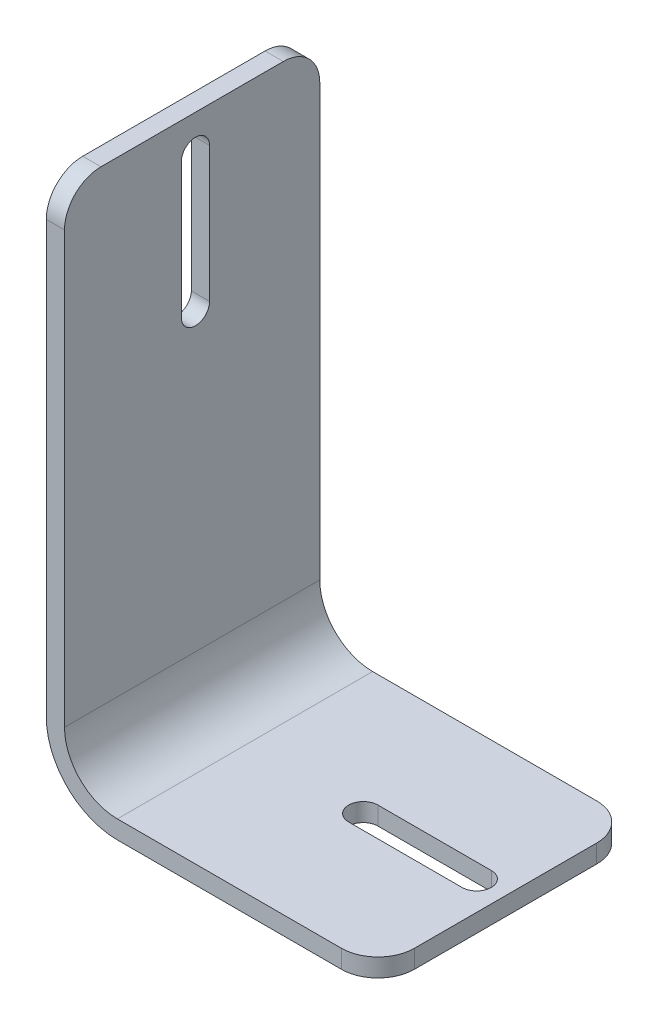
ISO-10303-21;
HEADER;
FILE_DESCRIPTION(('STEP AP214'),'2;1');
FILE_NAME('part.step','',(''),(''),'','','');
FILE_SCHEMA(('AUTOMOTIVE_DESIGN { 1 0 10303 214 1 1 1 1 }'));
ENDSEC;
DATA;
#1=APPLICATION_CONTEXT('core data for automotive mechanical design processes');
#2=APPLICATION_PROTOCOL_DEFINITION('international standard','automotive_design',2000,#1);
#3=PRODUCT_CONTEXT('',#1,'mechanical');
#4=PRODUCT('Part','Part','',(#3));
#5=PRODUCT_RELATED_PRODUCT_CATEGORY('part','',(#4));
#6=PRODUCT_DEFINITION_FORMATION('','',#4);
#7=PRODUCT_DEFINITION_CONTEXT('part definition',#1,'design');
#8=PRODUCT_DEFINITION('design','',#6,#7);
#9=PRODUCT_DEFINITION_SHAPE('','',#8);
#10=(LENGTH_UNIT() NAMED_UNIT(*) SI_UNIT(.MILLI.,.METRE.));
#11=(NAMED_UNIT(*) PLANE_ANGLE_UNIT() SI_UNIT($,.RADIAN.));
#12=(NAMED_UNIT(*) SI_UNIT($,.STERADIAN.) SOLID_ANGLE_UNIT());
#13=UNCERTAINTY_MEASURE_WITH_UNIT(LENGTH_MEASURE(1.E-05),#10,'distance_accuracy_value','');
#14=(GEOMETRIC_REPRESENTATION_CONTEXT(3) GLOBAL_UNCERTAINTY_ASSIGNED_CONTEXT((#13)) GLOBAL_UNIT_ASSIGNED_CONTEXT((#10,
#11,#12)) REPRESENTATION_CONTEXT('',''));
#15=CARTESIAN_POINT('',(0.,0.,0.));
#16=DIRECTION('',(0.,0.,1.));
#17=DIRECTION('',(1.,0.,0.));
#18=AXIS2_PLACEMENT_3D('',#15,#16,#17);
#19=CARTESIAN_POINT('',(7.36595814796508,-33.0752446861097,35.56));
#20=DIRECTION('',(0.,1.,0.));
#21=DIRECTION('',(0.,0.,1.));
#22=AXIS2_PLACEMENT_3D('',#19,#20,#21);
#23=PLANE('',#22);
#24=DIRECTION('',(1.,0.,0.));
#25=VECTOR('',#24,1.);
#26=CARTESIAN_POINT('',(39.6374300967312,-33.0752446861097,19.8216564871823));
#27=LINE('',#26,#25);
#28=CARTESIAN_POINT('',(23.8444104598593,-33.0752446861097,19.8216564871823));
#29=VERTEX_POINT('',#28);
#30=CARTESIAN_POINT('',(39.6374300967312,-33.0752446861097,19.8216564871823));
#31=VERTEX_POINT('',#30);
#32=EDGE_CURVE('E185',#29,#31,#27,.T.);
#33=ORIENTED_EDGE('',*,*,#32,.T.);
#34=CARTESIAN_POINT('',(39.6374300967312,-33.0752446861097,17.78));
#35=DIRECTION('',(0.,1.,0.));
#36=DIRECTION('',(0.,0.,1.));
#37=AXIS2_PLACEMENT_3D('',#34,#35,#36);
#38=CIRCLE('',#37,2.0416564871823);
#39=CARTESIAN_POINT('',(39.6374300967312,-33.0752446861097,15.7383435128177));
#40=VERTEX_POINT('',#39);
#41=EDGE_CURVE('E179',#31,#40,#38,.T.);
#42=ORIENTED_EDGE('',*,*,#41,.T.);
#43=DIRECTION('',(-1.,0.,0.));
#44=VECTOR('',#43,1.);
#45=CARTESIAN_POINT('',(39.6374300967312,-33.0752446861097,15.7383435128177));
#46=LINE('',#45,#44);
#47=CARTESIAN_POINT('',(23.8444104598593,-33.0752446861097,15.7383435128177));
#48=VERTEX_POINT('',#47);
#49=EDGE_CURVE('E188',#40,#48,#46,.T.);
#50=ORIENTED_EDGE('',*,*,#49,.T.);
#51=CARTESIAN_POINT('',(23.8444104598593,-33.0752446861097,17.78));
#52=DIRECTION('',(0.,1.,0.));
#53=DIRECTION('',(0.,0.,1.));
#54=AXIS2_PLACEMENT_3D('',#51,#52,#53);
#55=CIRCLE('',#54,2.0416564871823);
#56=EDGE_CURVE('E56',#48,#29,#55,.T.);
#57=ORIENTED_EDGE('',*,*,#56,.T.);
#58=EDGE_LOOP('',(#33,#42,#50,#57));
#59=FACE_BOUND('',#58,.T.);
#60=DIRECTION('',(0.,0.,-1.));
#61=VECTOR('',#60,1.);
#62=CARTESIAN_POINT('',(43.6600428406657,-33.0752446861097,35.56));
#63=LINE('',#62,#61);
#64=CARTESIAN_POINT('',(43.6600428406657,-33.0752446861097,30.48));
#65=VERTEX_POINT('',#64);
#66=CARTESIAN_POINT('',(43.6600428406657,-33.0752446861097,5.08000000000001));
#67=VERTEX_POINT('',#66);
#68=EDGE_CURVE('E294',#65,#67,#63,.T.);
#69=ORIENTED_EDGE('',*,*,#68,.F.);
#70=CARTESIAN_POINT('',(38.5800428406657,-33.0752446861097,30.48));
#71=DIRECTION('',(0.,1.,0.));
#72=DIRECTION('',(0.,0.,1.));
#73=AXIS2_PLACEMENT_3D('',#70,#71,#72);
#74=CIRCLE('',#73,5.08);
#75=CARTESIAN_POINT('',(38.5800428406657,-33.0752446861097,35.56));
#76=VERTEX_POINT('',#75);
#77=EDGE_CURVE('E304',#65,#76,#74,.F.);
#78=ORIENTED_EDGE('',*,*,#77,.T.);
#79=DIRECTION('',(1.,0.,0.));
#80=VECTOR('',#79,1.);
#81=CARTESIAN_POINT('',(7.36595814796508,-33.0752446861097,35.56));
#82=LINE('',#81,#80);
#83=CARTESIAN_POINT('',(7.36595814796507,-33.0752446861097,35.56));
#84=VERTEX_POINT('',#83);
#85=EDGE_CURVE('E245',#84,#76,#82,.T.);
#86=ORIENTED_EDGE('',*,*,#85,.F.);
#87=DIRECTION('',(0.,0.,-1.));
#88=VECTOR('',#87,1.);
#89=CARTESIAN_POINT('',(7.36595814796507,-33.0752446861097,35.56));
#90=LINE('',#89,#88);
#91=CARTESIAN_POINT('',(7.36595814796507,-33.0752446861097,0.));
#92=VERTEX_POINT('',#91);
#93=EDGE_CURVE('E261',#84,#92,#90,.T.);
#94=ORIENTED_EDGE('',*,*,#93,.T.);
#95=DIRECTION('',(1.,0.,0.));
#96=VECTOR('',#95,1.);
#97=CARTESIAN_POINT('',(7.36595814796508,-33.0752446861097,0.));
#98=LINE('',#97,#96);
#99=CARTESIAN_POINT('',(38.5800428406657,-33.0752446861097,0.));
#100=VERTEX_POINT('',#99);
#101=EDGE_CURVE('E238',#92,#100,#98,.T.);
#102=ORIENTED_EDGE('',*,*,#101,.T.);
#103=CARTESIAN_POINT('',(38.5800428406657,-33.0752446861097,5.08));
#104=DIRECTION('',(0.,1.,0.));
#105=DIRECTION('',(0.,0.,1.));
#106=AXIS2_PLACEMENT_3D('',#103,#104,#105);
#107=CIRCLE('',#106,5.08);
#108=EDGE_CURVE('E302',#100,#67,#107,.F.);
#109=ORIENTED_EDGE('',*,*,#108,.T.);
#110=EDGE_LOOP('',(#69,#78,#86,#94,#102,#109));
#111=FACE_BOUND('',#110,.T.);
#112=ADVANCED_FACE('F41',(#59,#111),#23,.F.);
#113=CARTESIAN_POINT('',(43.6600428406657,-30.5352446861097,35.56));
#114=DIRECTION('',(1.,0.,0.));
#115=DIRECTION('',(0.,0.,-1.));
#116=AXIS2_PLACEMENT_3D('',#113,#114,#115);
#117=PLANE('',#116);
#118=DIRECTION('',(0.,0.,-1.));
#119=VECTOR('',#118,1.);
#120=CARTESIAN_POINT('',(43.6600428406657,-30.5352446861097,35.56));
#121=LINE('',#120,#119);
#122=CARTESIAN_POINT('',(43.6600428406657,-30.5352446861097,30.48));
#123=VERTEX_POINT('',#122);
#124=CARTESIAN_POINT('',(43.6600428406657,-30.5352446861097,5.08000000000001));
#125=VERTEX_POINT('',#124);
#126=EDGE_CURVE('E291',#123,#125,#121,.T.);
#127=ORIENTED_EDGE('',*,*,#126,.F.);
#128=DIRECTION('',(0.,-1.,0.));
#129=VECTOR('',#128,1.);
#130=CARTESIAN_POINT('',(43.6600428406657,-30.5352446861097,30.48));
#131=LINE('',#130,#129);
#132=EDGE_CURVE('E299',#123,#65,#131,.T.);
#133=ORIENTED_EDGE('',*,*,#132,.T.);
#134=ORIENTED_EDGE('',*,*,#68,.T.);
#135=DIRECTION('',(0.,-1.,0.));
#136=VECTOR('',#135,1.);
#137=CARTESIAN_POINT('',(43.6600428406657,-30.5352446861097,5.08));
#138=LINE('',#137,#136);
#139=EDGE_CURVE('E297',#67,#125,#138,.F.);
#140=ORIENTED_EDGE('',*,*,#139,.T.);
#141=EDGE_LOOP('',(#127,#133,#134,#140));
#142=FACE_BOUND('',#141,.T.);
#143=ADVANCED_FACE('F380',(#142),#117,.T.);
#144=CARTESIAN_POINT('',(7.36595814796508,-30.5352446861097,35.56));
#145=DIRECTION('',(0.,1.,0.));
#146=DIRECTION('',(0.,0.,1.));
#147=AXIS2_PLACEMENT_3D('',#144,#145,#146);
#148=PLANE('',#147);
#149=CARTESIAN_POINT('',(39.6374300967312,-30.5352446861097,17.78));
#150=DIRECTION('',(0.,1.,0.));
#151=DIRECTION('',(0.,0.,1.));
#152=AXIS2_PLACEMENT_3D('',#149,#150,#151);
#153=CIRCLE('',#152,2.0416564871823);
#154=CARTESIAN_POINT('',(39.6374300967312,-30.5352446861097,19.8216564871823));
#155=VERTEX_POINT('',#154);
#156=CARTESIAN_POINT('',(39.6374300967312,-30.5352446861097,15.7383435128177));
#157=VERTEX_POINT('',#156);
#158=EDGE_CURVE('E64',#155,#157,#153,.T.);
#159=ORIENTED_EDGE('',*,*,#158,.F.);
#160=DIRECTION('',(1.,0.,0.));
#161=VECTOR('',#160,1.);
#162=CARTESIAN_POINT('',(39.6374300967312,-30.5352446861097,19.8216564871823));
#163=LINE('',#162,#161);
#164=CARTESIAN_POINT('',(23.8444104598593,-30.5352446861097,19.8216564871823));
#165=VERTEX_POINT('',#164);
#166=EDGE_CURVE('E194',#165,#155,#163,.T.);
#167=ORIENTED_EDGE('',*,*,#166,.F.);
#168=CARTESIAN_POINT('',(23.8444104598593,-30.5352446861097,17.78));
#169=DIRECTION('',(0.,1.,0.));
#170=DIRECTION('',(0.,0.,1.));
#171=AXIS2_PLACEMENT_3D('',#168,#169,#170);
#172=CIRCLE('',#171,2.0416564871823);
#173=CARTESIAN_POINT('',(23.8444104598593,-30.5352446861097,15.7383435128177));
#174=VERTEX_POINT('',#173);
#175=EDGE_CURVE('E197',#174,#165,#172,.T.);
#176=ORIENTED_EDGE('',*,*,#175,.F.);
#177=DIRECTION('',(-1.,0.,0.));
#178=VECTOR('',#177,1.);
#179=CARTESIAN_POINT('',(39.6374300967312,-30.5352446861097,15.7383435128177));
#180=LINE('',#179,#178);
#181=EDGE_CURVE('E203',#157,#174,#180,.T.);
#182=ORIENTED_EDGE('',*,*,#181,.F.);
#183=EDGE_LOOP('',(#159,#167,#176,#182));
#184=FACE_BOUND('',#183,.T.);
#185=DIRECTION('',(1.,0.,0.));
#186=VECTOR('',#185,1.);
#187=CARTESIAN_POINT('',(7.36595814796508,-30.5352446861097,35.56));
#188=LINE('',#187,#186);
#189=CARTESIAN_POINT('',(7.36595814796507,-30.5352446861097,35.56));
#190=VERTEX_POINT('',#189);
#191=CARTESIAN_POINT('',(38.5800428406657,-30.5352446861097,35.56));
#192=VERTEX_POINT('',#191);
#193=EDGE_CURVE('E248',#190,#192,#188,.T.);
#194=ORIENTED_EDGE('',*,*,#193,.T.);
#195=CARTESIAN_POINT('',(38.5800428406657,-30.5352446861097,30.48));
#196=DIRECTION('',(0.,1.,0.));
#197=DIRECTION('',(0.,0.,1.));
#198=AXIS2_PLACEMENT_3D('',#195,#196,#197);
#199=CIRCLE('',#198,5.08);
#200=EDGE_CURVE('E312',#192,#123,#199,.T.);
#201=ORIENTED_EDGE('',*,*,#200,.T.);
#202=ORIENTED_EDGE('',*,*,#126,.T.);
#203=CARTESIAN_POINT('',(38.5800428406657,-30.5352446861097,5.08));
#204=DIRECTION('',(0.,1.,0.));
#205=DIRECTION('',(0.,0.,1.));
#206=AXIS2_PLACEMENT_3D('',#203,#204,#205);
#207=CIRCLE('',#206,5.08);
#208=CARTESIAN_POINT('',(38.5800428406657,-30.5352446861097,0.));
#209=VERTEX_POINT('',#208);
#210=EDGE_CURVE('E310',#125,#209,#207,.T.);
#211=ORIENTED_EDGE('',*,*,#210,.T.);
#212=DIRECTION('',(1.,0.,0.));
#213=VECTOR('',#212,1.);
#214=CARTESIAN_POINT('',(7.36595814796508,-30.5352446861097,0.));
#215=LINE('',#214,#213);
#216=CARTESIAN_POINT('',(7.36595814796507,-30.5352446861097,0.));
#217=VERTEX_POINT('',#216);
#218=EDGE_CURVE('E264',#217,#209,#215,.T.);
#219=ORIENTED_EDGE('',*,*,#218,.F.);
#220=DIRECTION('',(0.,0.,-1.));
#221=VECTOR('',#220,1.);
#222=CARTESIAN_POINT('',(7.36595814796507,-30.5352446861097,35.56));
#223=LINE('',#222,#221);
#224=EDGE_CURVE('E289',#190,#217,#223,.T.);
#225=ORIENTED_EDGE('',*,*,#224,.F.);
#226=EDGE_LOOP('',(#194,#201,#202,#211,#219,#225));
#227=FACE_BOUND('',#226,.T.);
#228=ADVANCED_FACE('F377',(#184,#227),#148,.T.);
#229=CARTESIAN_POINT('',(7.36595814796508,-23.1692865381447,35.56));
#230=DIRECTION('',(0.,0.,-1.));
#231=DIRECTION('',(-1.,0.,0.));
#232=AXIS2_PLACEMENT_3D('',#229,#230,#231);
#233=CYLINDRICAL_SURFACE('',#232,7.36595814796508);
#234=CARTESIAN_POINT('',(7.36595814796508,-23.1692865381447,0.));
#235=DIRECTION('',(0.,0.,1.));
#236=DIRECTION('',(1.,0.,0.));
#237=AXIS2_PLACEMENT_3D('',#234,#235,#236);
#238=CIRCLE('',#237,7.36595814796508);
#239=CARTESIAN_POINT('',(0.,-23.1692865381447,0.));
#240=VERTEX_POINT('',#239);
#241=EDGE_CURVE('E267',#240,#217,#238,.T.);
#242=ORIENTED_EDGE('',*,*,#241,.F.);
#243=DIRECTION('',(0.,0.,-1.));
#244=VECTOR('',#243,1.);
#245=CARTESIAN_POINT('',(0.,-23.1692865381447,35.56));
#246=LINE('',#245,#244);
#247=CARTESIAN_POINT('',(0.,-23.1692865381447,35.56));
#248=VERTEX_POINT('',#247);
#249=EDGE_CURVE('E286',#248,#240,#246,.T.);
#250=ORIENTED_EDGE('',*,*,#249,.F.);
#251=CARTESIAN_POINT('',(7.36595814796508,-23.1692865381447,35.56));
#252=DIRECTION('',(0.,0.,1.));
#253=DIRECTION('',(1.,0.,0.));
#254=AXIS2_PLACEMENT_3D('',#251,#252,#253);
#255=CIRCLE('',#254,7.36595814796508);
#256=EDGE_CURVE('E252',#248,#190,#255,.T.);
#257=ORIENTED_EDGE('',*,*,#256,.T.);
#258=ORIENTED_EDGE('',*,*,#224,.T.);
#259=EDGE_LOOP('',(#242,#250,#257,#258));
#260=FACE_BOUND('',#259,.T.);
#261=ADVANCED_FACE('F353',(#260),#233,.F.);
#262=CARTESIAN_POINT('',(0.,41.9189981875103,35.56));
#263=DIRECTION('',(1.,0.,0.));
#264=DIRECTION('',(0.,0.,-1.));
#265=AXIS2_PLACEMENT_3D('',#262,#263,#264);
#266=PLANE('',#265);
#267=CARTESIAN_POINT('',(0.,36.9343476180831,17.317745415077));
#268=DIRECTION('',(1.,0.,0.));
#269=DIRECTION('',(0.,0.,-1.));
#270=AXIS2_PLACEMENT_3D('',#267,#268,#269);
#271=CIRCLE('',#270,1.96418742918986);
#272=CARTESIAN_POINT('',(0.,36.9343476180831,15.3535579858872));
#273=VERTEX_POINT('',#272);
#274=CARTESIAN_POINT('',(0.,36.9343476180831,19.2819328442669));
#275=VERTEX_POINT('',#274);
#276=EDGE_CURVE('E209',#273,#275,#271,.T.);
#277=ORIENTED_EDGE('',*,*,#276,.F.);
#278=DIRECTION('',(0.,1.,0.));
#279=VECTOR('',#278,1.);
#280=CARTESIAN_POINT('',(0.,36.9343476180831,15.3535579858872));
#281=LINE('',#280,#279);
#282=CARTESIAN_POINT('',(0.,18.1194996121573,15.353557985887));
#283=VERTEX_POINT('',#282);
#284=EDGE_CURVE('E217',#283,#273,#281,.T.);
#285=ORIENTED_EDGE('',*,*,#284,.F.);
#286=CARTESIAN_POINT('',(0.,18.1194996121573,17.317745415077));
#287=DIRECTION('',(1.,0.,0.));
#288=DIRECTION('',(0.,0.,-1.));
#289=AXIS2_PLACEMENT_3D('',#286,#287,#288);
#290=CIRCLE('',#289,1.96418742919008);
#291=CARTESIAN_POINT('',(0.,18.1194996121573,19.2819328442671));
#292=VERTEX_POINT('',#291);
#293=EDGE_CURVE('E231',#292,#283,#290,.T.);
#294=ORIENTED_EDGE('',*,*,#293,.F.);
#295=DIRECTION('',(0.,-1.,0.));
#296=VECTOR('',#295,1.);
#297=CARTESIAN_POINT('',(0.,36.9343476180831,19.2819328442669));
#298=LINE('',#297,#296);
#299=EDGE_CURVE('E228',#275,#292,#298,.T.);
#300=ORIENTED_EDGE('',*,*,#299,.F.);
#301=EDGE_LOOP('',(#277,#285,#294,#300));
#302=FACE_BOUND('',#301,.T.);
#303=DIRECTION('',(0.,-1.,0.));
#304=VECTOR('',#303,1.);
#305=CARTESIAN_POINT('',(0.,41.9189981875103,0.));
#306=LINE('',#305,#304);
#307=CARTESIAN_POINT('',(0.,36.8389981875103,0.));
#308=VERTEX_POINT('',#307);
#309=EDGE_CURVE('E270',#308,#240,#306,.T.);
#310=ORIENTED_EDGE('',*,*,#309,.F.);
#311=CARTESIAN_POINT('',(0.,36.8389981875103,5.08));
#312=DIRECTION('',(1.,0.,0.));
#313=DIRECTION('',(0.,0.,-1.));
#314=AXIS2_PLACEMENT_3D('',#311,#312,#313);
#315=CIRCLE('',#314,5.08);
#316=CARTESIAN_POINT('',(0.,41.9189981875103,5.08000000000001));
#317=VERTEX_POINT('',#316);
#318=EDGE_CURVE('E322',#308,#317,#315,.T.);
#319=ORIENTED_EDGE('',*,*,#318,.T.);
#320=DIRECTION('',(0.,0.,-1.));
#321=VECTOR('',#320,1.);
#322=CARTESIAN_POINT('',(0.,41.9189981875103,35.56));
#323=LINE('',#322,#321);
#324=CARTESIAN_POINT('',(0.,41.9189981875103,30.48));
#325=VERTEX_POINT('',#324);
#326=EDGE_CURVE('E283',#325,#317,#323,.T.);
#327=ORIENTED_EDGE('',*,*,#326,.F.);
#328=CARTESIAN_POINT('',(0.,36.8389981875103,30.48));
#329=DIRECTION('',(1.,0.,0.));
#330=DIRECTION('',(0.,0.,-1.));
#331=AXIS2_PLACEMENT_3D('',#328,#329,#330);
#332=CIRCLE('',#331,5.08);
#333=CARTESIAN_POINT('',(0.,36.8389981875103,35.56));
#334=VERTEX_POINT('',#333);
#335=EDGE_CURVE('E320',#325,#334,#332,.T.);
#336=ORIENTED_EDGE('',*,*,#335,.T.);
#337=DIRECTION('',(0.,-1.,0.));
#338=VECTOR('',#337,1.);
#339=CARTESIAN_POINT('',(0.,41.9189981875103,35.56));
#340=LINE('',#339,#338);
#341=EDGE_CURVE('E255',#334,#248,#340,.T.);
#342=ORIENTED_EDGE('',*,*,#341,.T.);
#343=ORIENTED_EDGE('',*,*,#249,.T.);
#344=EDGE_LOOP('',(#310,#319,#327,#336,#342,#343));
#345=FACE_BOUND('',#344,.T.);
#346=ADVANCED_FACE('F345',(#302,#345),#266,.T.);
#347=CARTESIAN_POINT('',(-2.54,41.9189981875103,35.56));
#348=DIRECTION('',(0.,1.,0.));
#349=DIRECTION('',(0.,0.,1.));
#350=AXIS2_PLACEMENT_3D('',#347,#348,#349);
#351=PLANE('',#350);
#352=ORIENTED_EDGE('',*,*,#326,.T.);
#353=DIRECTION('',(1.,0.,0.));
#354=VECTOR('',#353,1.);
#355=CARTESIAN_POINT('',(-2.54,41.9189981875103,5.08));
#356=LINE('',#355,#354);
#357=CARTESIAN_POINT('',(-2.54,41.9189981875103,5.08000000000001));
#358=VERTEX_POINT('',#357);
#359=EDGE_CURVE('E327',#317,#358,#356,.F.);
#360=ORIENTED_EDGE('',*,*,#359,.T.);
#361=DIRECTION('',(0.,0.,-1.));
#362=VECTOR('',#361,1.);
#363=CARTESIAN_POINT('',(-2.54,41.9189981875103,35.56));
#364=LINE('',#363,#362);
#365=CARTESIAN_POINT('',(-2.54,41.9189981875103,30.48));
#366=VERTEX_POINT('',#365);
#367=EDGE_CURVE('E280',#366,#358,#364,.T.);
#368=ORIENTED_EDGE('',*,*,#367,.F.);
#369=DIRECTION('',(1.,0.,0.));
#370=VECTOR('',#369,1.);
#371=CARTESIAN_POINT('',(-2.54,41.9189981875103,30.48));
#372=LINE('',#371,#370);
#373=EDGE_CURVE('E324',#366,#325,#372,.T.);
#374=ORIENTED_EDGE('',*,*,#373,.T.);
#375=EDGE_LOOP('',(#352,#360,#368,#374));
#376=FACE_BOUND('',#375,.T.);
#377=ADVANCED_FACE('F339',(#376),#351,.T.);
#378=CARTESIAN_POINT('',(-2.54,41.9189981875103,35.56));
#379=DIRECTION('',(1.,0.,0.));
#380=DIRECTION('',(0.,0.,-1.));
#381=AXIS2_PLACEMENT_3D('',#378,#379,#380);
#382=PLANE('',#381);
#383=DIRECTION('',(0.,1.,0.));
#384=VECTOR('',#383,1.);
#385=CARTESIAN_POINT('',(-2.54,36.9343476180831,15.3535579858872));
#386=LINE('',#385,#384);
#387=CARTESIAN_POINT('',(-2.54,18.1194996121573,15.353557985887));
#388=VERTEX_POINT('',#387);
#389=CARTESIAN_POINT('',(-2.54,36.9343476180831,15.3535579858872));
#390=VERTEX_POINT('',#389);
#391=EDGE_CURVE('E223',#388,#390,#386,.T.);
#392=ORIENTED_EDGE('',*,*,#391,.T.);
#393=CARTESIAN_POINT('',(-2.54,36.9343476180831,17.317745415077));
#394=DIRECTION('',(1.,0.,0.));
#395=DIRECTION('',(0.,0.,-1.));
#396=AXIS2_PLACEMENT_3D('',#393,#394,#395);
#397=CIRCLE('',#396,1.96418742918986);
#398=CARTESIAN_POINT('',(-2.54,36.9343476180831,19.2819328442669));
#399=VERTEX_POINT('',#398);
#400=EDGE_CURVE('E213',#390,#399,#397,.T.);
#401=ORIENTED_EDGE('',*,*,#400,.T.);
#402=DIRECTION('',(0.,-1.,0.));
#403=VECTOR('',#402,1.);
#404=CARTESIAN_POINT('',(-2.54,36.9343476180831,19.2819328442669));
#405=LINE('',#404,#403);
#406=CARTESIAN_POINT('',(-2.54,18.1194996121573,19.2819328442671));
#407=VERTEX_POINT('',#406);
#408=EDGE_CURVE('E216',#399,#407,#405,.T.);
#409=ORIENTED_EDGE('',*,*,#408,.T.);
#410=CARTESIAN_POINT('',(-2.54,18.1194996121573,17.317745415077));
#411=DIRECTION('',(1.,0.,0.));
#412=DIRECTION('',(0.,0.,-1.));
#413=AXIS2_PLACEMENT_3D('',#410,#411,#412);
#414=CIRCLE('',#413,1.96418742919008);
#415=EDGE_CURVE('E220',#407,#388,#414,.T.);
#416=ORIENTED_EDGE('',*,*,#415,.T.);
#417=EDGE_LOOP('',(#392,#401,#409,#416));
#418=FACE_BOUND('',#417,.T.);
#419=ORIENTED_EDGE('',*,*,#367,.T.);
#420=CARTESIAN_POINT('',(-2.54,36.8389981875103,5.08));
#421=DIRECTION('',(1.,0.,0.));
#422=DIRECTION('',(0.,0.,-1.));
#423=AXIS2_PLACEMENT_3D('',#420,#421,#422);
#424=CIRCLE('',#423,5.08);
#425=CARTESIAN_POINT('',(-2.54,36.8389981875103,0.));
#426=VERTEX_POINT('',#425);
#427=EDGE_CURVE('E11',#358,#426,#424,.F.);
#428=ORIENTED_EDGE('',*,*,#427,.T.);
#429=DIRECTION('',(0.,1.,0.));
#430=VECTOR('',#429,1.);
#431=CARTESIAN_POINT('',(-2.54,41.9189981875103,0.));
#432=LINE('',#431,#430);
#433=CARTESIAN_POINT('',(-2.54,-23.1692865381447,0.));
#434=VERTEX_POINT('',#433);
#435=EDGE_CURVE('E272',#426,#434,#432,.F.);
#436=ORIENTED_EDGE('',*,*,#435,.T.);
#437=DIRECTION('',(0.,0.,-1.));
#438=VECTOR('',#437,1.);
#439=CARTESIAN_POINT('',(-2.54,-23.1692865381447,35.56));
#440=LINE('',#439,#438);
#441=CARTESIAN_POINT('',(-2.54,-23.1692865381447,35.56));
#442=VERTEX_POINT('',#441);
#443=EDGE_CURVE('E277',#442,#434,#440,.T.);
#444=ORIENTED_EDGE('',*,*,#443,.F.);
#445=DIRECTION('',(0.,1.,0.));
#446=VECTOR('',#445,1.);
#447=CARTESIAN_POINT('',(-2.54,41.9189981875103,35.56));
#448=LINE('',#447,#446);
#449=CARTESIAN_POINT('',(-2.54,36.8389981875103,35.56));
#450=VERTEX_POINT('',#449);
#451=EDGE_CURVE('E257',#450,#442,#448,.F.);
#452=ORIENTED_EDGE('',*,*,#451,.F.);
#453=CARTESIAN_POINT('',(-2.54,36.8389981875103,30.48));
#454=DIRECTION('',(1.,0.,0.));
#455=DIRECTION('',(0.,0.,-1.));
#456=AXIS2_PLACEMENT_3D('',#453,#454,#455);
#457=CIRCLE('',#456,5.08);
#458=EDGE_CURVE('E49',#450,#366,#457,.F.);
#459=ORIENTED_EDGE('',*,*,#458,.T.);
#460=EDGE_LOOP('',(#419,#428,#436,#444,#452,#459));
#461=FACE_BOUND('',#460,.T.);
#462=ADVANCED_FACE('F332',(#418,#461),#382,.F.);
#463=CARTESIAN_POINT('',(7.36595814796508,-23.1692865381447,35.56));
#464=DIRECTION('',(0.,0.,-1.));
#465=DIRECTION('',(-1.,0.,0.));
#466=AXIS2_PLACEMENT_3D('',#463,#464,#465);
#467=CYLINDRICAL_SURFACE('',#466,9.90595814796508);
#468=CARTESIAN_POINT('',(7.36595814796508,-23.1692865381447,0.));
#469=DIRECTION('',(0.,0.,1.));
#470=DIRECTION('',(1.,0.,0.));
#471=AXIS2_PLACEMENT_3D('',#468,#469,#470);
#472=CIRCLE('',#471,9.90595814796508);
#473=EDGE_CURVE('E249',#434,#92,#472,.T.);
#474=ORIENTED_EDGE('',*,*,#473,.T.);
#475=ORIENTED_EDGE('',*,*,#93,.F.);
#476=CARTESIAN_POINT('',(7.36595814796508,-23.1692865381447,35.56));
#477=DIRECTION('',(0.,0.,1.));
#478=DIRECTION('',(1.,0.,0.));
#479=AXIS2_PLACEMENT_3D('',#476,#477,#478);
#480=CIRCLE('',#479,9.90595814796508);
#481=EDGE_CURVE('E259',#442,#84,#480,.T.);
#482=ORIENTED_EDGE('',*,*,#481,.F.);
#483=ORIENTED_EDGE('',*,*,#443,.T.);
#484=EDGE_LOOP('',(#474,#475,#482,#483));
#485=FACE_BOUND('',#484,.T.);
#486=ADVANCED_FACE('F364',(#485),#467,.T.);
#487=CARTESIAN_POINT('',(7.36595814796508,-23.1692865381447,35.56));
#488=DIRECTION('',(0.,0.,1.));
#489=DIRECTION('',(1.,0.,0.));
#490=AXIS2_PLACEMENT_3D('',#487,#488,#489);
#491=PLANE('',#490);
#492=ORIENTED_EDGE('',*,*,#85,.T.);
#493=DIRECTION('',(0.,-1.,0.));
#494=VECTOR('',#493,1.);
#495=CARTESIAN_POINT('',(38.5800428406657,-23.1692865381447,35.56));
#496=LINE('',#495,#494);
#497=EDGE_CURVE('E308',#76,#192,#496,.F.);
#498=ORIENTED_EDGE('',*,*,#497,.T.);
#499=ORIENTED_EDGE('',*,*,#193,.F.);
#500=ORIENTED_EDGE('',*,*,#256,.F.);
#501=ORIENTED_EDGE('',*,*,#341,.F.);
#502=DIRECTION('',(1.,0.,0.));
#503=VECTOR('',#502,1.);
#504=CARTESIAN_POINT('',(7.36595814796508,36.8389981875103,35.56));
#505=LINE('',#504,#503);
#506=EDGE_CURVE('E306',#334,#450,#505,.F.);
#507=ORIENTED_EDGE('',*,*,#506,.T.);
#508=ORIENTED_EDGE('',*,*,#451,.T.);
#509=ORIENTED_EDGE('',*,*,#481,.T.);
#510=EDGE_LOOP('',(#492,#498,#499,#500,#501,#507,#508,#509));
#511=FACE_BOUND('',#510,.T.);
#512=ADVANCED_FACE('F349',(#511),#491,.T.);
#513=CARTESIAN_POINT('',(7.36595814796508,-23.1692865381447,0.));
#514=DIRECTION('',(0.,0.,1.));
#515=DIRECTION('',(1.,0.,0.));
#516=AXIS2_PLACEMENT_3D('',#513,#514,#515);
#517=PLANE('',#516);
#518=ORIENTED_EDGE('',*,*,#218,.T.);
#519=DIRECTION('',(0.,-1.,0.));
#520=VECTOR('',#519,1.);
#521=CARTESIAN_POINT('',(38.5800428406657,-33.0752446861097,0.));
#522=LINE('',#521,#520);
#523=EDGE_CURVE('E317',#209,#100,#522,.T.);
#524=ORIENTED_EDGE('',*,*,#523,.T.);
#525=ORIENTED_EDGE('',*,*,#101,.F.);
#526=ORIENTED_EDGE('',*,*,#473,.F.);
#527=ORIENTED_EDGE('',*,*,#435,.F.);
#528=DIRECTION('',(1.,0.,0.));
#529=VECTOR('',#528,1.);
#530=CARTESIAN_POINT('',(0.,36.8389981875103,0.));
#531=LINE('',#530,#529);
#532=EDGE_CURVE('E314',#426,#308,#531,.T.);
#533=ORIENTED_EDGE('',*,*,#532,.T.);
#534=ORIENTED_EDGE('',*,*,#309,.T.);
#535=ORIENTED_EDGE('',*,*,#241,.T.);
#536=EDGE_LOOP('',(#518,#524,#525,#526,#527,#533,#534,#535));
#537=FACE_BOUND('',#536,.T.);
#538=ADVANCED_FACE('F356',(#537),#517,.F.);
#539=CARTESIAN_POINT('',(38.5800428406657,-30.5352446861097,30.48));
#540=DIRECTION('',(0.,-1.,0.));
#541=DIRECTION('',(0.,0.,-1.));
#542=AXIS2_PLACEMENT_3D('',#539,#540,#541);
#543=CYLINDRICAL_SURFACE('',#542,5.08);
#544=ORIENTED_EDGE('',*,*,#200,.F.);
#545=ORIENTED_EDGE('',*,*,#497,.F.);
#546=ORIENTED_EDGE('',*,*,#77,.F.);
#547=ORIENTED_EDGE('',*,*,#132,.F.);
#548=EDGE_LOOP('',(#544,#545,#546,#547));
#549=FACE_BOUND('',#548,.T.);
#550=ADVANCED_FACE('F373',(#549),#543,.T.);
#551=CARTESIAN_POINT('',(38.5800428406657,-23.1692865381447,5.08));
#552=DIRECTION('',(0.,1.,0.));
#553=DIRECTION('',(0.,0.,1.));
#554=AXIS2_PLACEMENT_3D('',#551,#552,#553);
#555=CYLINDRICAL_SURFACE('',#554,5.08);
#556=ORIENTED_EDGE('',*,*,#210,.F.);
#557=ORIENTED_EDGE('',*,*,#139,.F.);
#558=ORIENTED_EDGE('',*,*,#108,.F.);
#559=ORIENTED_EDGE('',*,*,#523,.F.);
#560=EDGE_LOOP('',(#556,#557,#558,#559));
#561=FACE_BOUND('',#560,.T.);
#562=ADVANCED_FACE('F383',(#561),#555,.T.);
#563=CARTESIAN_POINT('',(7.36595814796508,36.8389981875103,5.08));
#564=DIRECTION('',(-1.,0.,0.));
#565=DIRECTION('',(0.,0.,1.));
#566=AXIS2_PLACEMENT_3D('',#563,#564,#565);
#567=CYLINDRICAL_SURFACE('',#566,5.08);
#568=ORIENTED_EDGE('',*,*,#427,.F.);
#569=ORIENTED_EDGE('',*,*,#359,.F.);
#570=ORIENTED_EDGE('',*,*,#318,.F.);
#571=ORIENTED_EDGE('',*,*,#532,.F.);
#572=EDGE_LOOP('',(#568,#569,#570,#571));
#573=FACE_BOUND('',#572,.T.);
#574=ADVANCED_FACE('F361',(#573),#567,.T.);
#575=CARTESIAN_POINT('',(-2.54,36.8389981875103,30.48));
#576=DIRECTION('',(1.,0.,0.));
#577=DIRECTION('',(0.,0.,-1.));
#578=AXIS2_PLACEMENT_3D('',#575,#576,#577);
#579=CYLINDRICAL_SURFACE('',#578,5.08);
#580=ORIENTED_EDGE('',*,*,#458,.F.);
#581=ORIENTED_EDGE('',*,*,#506,.F.);
#582=ORIENTED_EDGE('',*,*,#335,.F.);
#583=ORIENTED_EDGE('',*,*,#373,.F.);
#584=EDGE_LOOP('',(#580,#581,#582,#583));
#585=FACE_BOUND('',#584,.T.);
#586=ADVANCED_FACE('F43',(#585),#579,.T.);
#587=CARTESIAN_POINT('',(-2.54,36.9343476180831,17.317745415077));
#588=DIRECTION('',(1.,0.,0.));
#589=DIRECTION('',(0.,0.,-1.));
#590=AXIS2_PLACEMENT_3D('',#587,#588,#589);
#591=CYLINDRICAL_SURFACE('',#590,1.96418742918986);
#592=ORIENTED_EDGE('',*,*,#276,.T.);
#593=DIRECTION('',(1.,0.,0.));
#594=VECTOR('',#593,1.);
#595=CARTESIAN_POINT('',(-2.54,36.9343476180831,19.2819328442669));
#596=LINE('',#595,#594);
#597=EDGE_CURVE('E226',#399,#275,#596,.T.);
#598=ORIENTED_EDGE('',*,*,#597,.F.);
#599=ORIENTED_EDGE('',*,*,#400,.F.);
#600=DIRECTION('',(1.,0.,0.));
#601=VECTOR('',#600,1.);
#602=CARTESIAN_POINT('',(-2.54,36.9343476180831,15.3535579858872));
#603=LINE('',#602,#601);
#604=EDGE_CURVE('E236',#390,#273,#603,.T.);
#605=ORIENTED_EDGE('',*,*,#604,.T.);
#606=EDGE_LOOP('',(#592,#598,#599,#605));
#607=FACE_BOUND('',#606,.T.);
#608=ADVANCED_FACE('F417',(#607),#591,.F.);
#609=CARTESIAN_POINT('',(-2.54,36.9343476180831,15.3535579858872));
#610=DIRECTION('',(0.,0.,-1.));
#611=DIRECTION('',(0.,1.,0.));
#612=AXIS2_PLACEMENT_3D('',#609,#610,#611);
#613=PLANE('',#612);
#614=ORIENTED_EDGE('',*,*,#284,.T.);
#615=ORIENTED_EDGE('',*,*,#604,.F.);
#616=ORIENTED_EDGE('',*,*,#391,.F.);
#617=DIRECTION('',(1.,0.,0.));
#618=VECTOR('',#617,1.);
#619=CARTESIAN_POINT('',(-2.54,18.1194996121573,15.353557985887));
#620=LINE('',#619,#618);
#621=EDGE_CURVE('E239',#388,#283,#620,.T.);
#622=ORIENTED_EDGE('',*,*,#621,.T.);
#623=EDGE_LOOP('',(#614,#615,#616,#622));
#624=FACE_BOUND('',#623,.T.);
#625=ADVANCED_FACE('F420',(#624),#613,.F.);
#626=CARTESIAN_POINT('',(-2.54,18.1194996121573,17.317745415077));
#627=DIRECTION('',(1.,0.,0.));
#628=DIRECTION('',(0.,0.,-1.));
#629=AXIS2_PLACEMENT_3D('',#626,#627,#628);
#630=CYLINDRICAL_SURFACE('',#629,1.96418742919008);
#631=ORIENTED_EDGE('',*,*,#293,.T.);
#632=ORIENTED_EDGE('',*,*,#621,.F.);
#633=ORIENTED_EDGE('',*,*,#415,.F.);
#634=DIRECTION('',(1.,0.,0.));
#635=VECTOR('',#634,1.);
#636=CARTESIAN_POINT('',(-2.54,18.1194996121573,19.2819328442671));
#637=LINE('',#636,#635);
#638=EDGE_CURVE('E241',#407,#292,#637,.T.);
#639=ORIENTED_EDGE('',*,*,#638,.T.);
#640=EDGE_LOOP('',(#631,#632,#633,#639));
#641=FACE_BOUND('',#640,.T.);
#642=ADVANCED_FACE('F425',(#641),#630,.F.);
#643=CARTESIAN_POINT('',(-2.54,36.9343476180831,19.2819328442669));
#644=DIRECTION('',(0.,0.,1.));
#645=DIRECTION('',(0.,-1.,0.));
#646=AXIS2_PLACEMENT_3D('',#643,#644,#645);
#647=PLANE('',#646);
#648=ORIENTED_EDGE('',*,*,#299,.T.);
#649=ORIENTED_EDGE('',*,*,#638,.F.);
#650=ORIENTED_EDGE('',*,*,#408,.F.);
#651=ORIENTED_EDGE('',*,*,#597,.T.);
#652=EDGE_LOOP('',(#648,#649,#650,#651));
#653=FACE_BOUND('',#652,.T.);
#654=ADVANCED_FACE('F422',(#653),#647,.F.);
#655=CARTESIAN_POINT('',(39.6374300967312,-33.0752446861097,17.78));
#656=DIRECTION('',(0.,1.,0.));
#657=DIRECTION('',(0.,0.,1.));
#658=AXIS2_PLACEMENT_3D('',#655,#656,#657);
#659=CYLINDRICAL_SURFACE('',#658,2.0416564871823);
#660=ORIENTED_EDGE('',*,*,#158,.T.);
#661=DIRECTION('',(0.,1.,0.));
#662=VECTOR('',#661,1.);
#663=CARTESIAN_POINT('',(39.6374300967312,-33.0752446861097,15.7383435128177));
#664=LINE('',#663,#662);
#665=EDGE_CURVE('E175',#40,#157,#664,.T.);
#666=ORIENTED_EDGE('',*,*,#665,.F.);
#667=ORIENTED_EDGE('',*,*,#41,.F.);
#668=DIRECTION('',(0.,1.,0.));
#669=VECTOR('',#668,1.);
#670=CARTESIAN_POINT('',(39.6374300967312,-33.0752446861097,19.8216564871823));
#671=LINE('',#670,#669);
#672=EDGE_CURVE('E207',#31,#155,#671,.T.);
#673=ORIENTED_EDGE('',*,*,#672,.T.);
#674=EDGE_LOOP('',(#660,#666,#667,#673));
#675=FACE_BOUND('',#674,.T.);
#676=ADVANCED_FACE('F177',(#675),#659,.F.);
#677=CARTESIAN_POINT('',(39.6374300967312,-33.0752446861097,19.8216564871823));
#678=DIRECTION('',(0.,0.,1.));
#679=DIRECTION('',(1.,0.,0.));
#680=AXIS2_PLACEMENT_3D('',#677,#678,#679);
#681=PLANE('',#680);
#682=ORIENTED_EDGE('',*,*,#166,.T.);
#683=ORIENTED_EDGE('',*,*,#672,.F.);
#684=ORIENTED_EDGE('',*,*,#32,.F.);
#685=DIRECTION('',(0.,1.,0.));
#686=VECTOR('',#685,1.);
#687=CARTESIAN_POINT('',(23.8444104598593,-33.0752446861097,19.8216564871823));
#688=LINE('',#687,#686);
#689=EDGE_CURVE('E210',#29,#165,#688,.T.);
#690=ORIENTED_EDGE('',*,*,#689,.T.);
#691=EDGE_LOOP('',(#682,#683,#684,#690));
#692=FACE_BOUND('',#691,.T.);
#693=ADVANCED_FACE('F435',(#692),#681,.F.);
#694=CARTESIAN_POINT('',(23.8444104598593,-33.0752446861097,17.78));
#695=DIRECTION('',(0.,1.,0.));
#696=DIRECTION('',(0.,0.,1.));
#697=AXIS2_PLACEMENT_3D('',#694,#695,#696);
#698=CYLINDRICAL_SURFACE('',#697,2.0416564871823);
#699=ORIENTED_EDGE('',*,*,#175,.T.);
#700=ORIENTED_EDGE('',*,*,#689,.F.);
#701=ORIENTED_EDGE('',*,*,#56,.F.);
#702=DIRECTION('',(0.,1.,0.));
#703=VECTOR('',#702,1.);
#704=CARTESIAN_POINT('',(23.8444104598593,-33.0752446861097,15.7383435128177));
#705=LINE('',#704,#703);
#706=EDGE_CURVE('E184',#48,#174,#705,.T.);
#707=ORIENTED_EDGE('',*,*,#706,.T.);
#708=EDGE_LOOP('',(#699,#700,#701,#707));
#709=FACE_BOUND('',#708,.T.);
#710=ADVANCED_FACE('F438',(#709),#698,.F.);
#711=CARTESIAN_POINT('',(39.6374300967312,-33.0752446861097,15.7383435128177));
#712=DIRECTION('',(0.,0.,-1.));
#713=DIRECTION('',(-1.,0.,0.));
#714=AXIS2_PLACEMENT_3D('',#711,#712,#713);
#715=PLANE('',#714);
#716=ORIENTED_EDGE('',*,*,#181,.T.);
#717=ORIENTED_EDGE('',*,*,#706,.F.);
#718=ORIENTED_EDGE('',*,*,#49,.F.);
#719=ORIENTED_EDGE('',*,*,#665,.T.);
#720=EDGE_LOOP('',(#716,#717,#718,#719));
#721=FACE_BOUND('',#720,.T.);
#722=ADVANCED_FACE('F189',(#721),#715,.F.);
#723=CLOSED_SHELL('',(#112,#143,#228,#261,#346,#377,#462,#486,#512,#538,#550,#562,#574,#586,
#608,#625,#642,#654,#676,#693,#710,#722));
#724=MANIFOLD_SOLID_BREP('B2',#723);
#725=ADVANCED_BREP_SHAPE_REPRESENTATION('',(#18,#724),#14);
#726=SHAPE_DEFINITION_REPRESENTATION(#9,#725);
ENDSEC;
END-ISO-10303-21;
